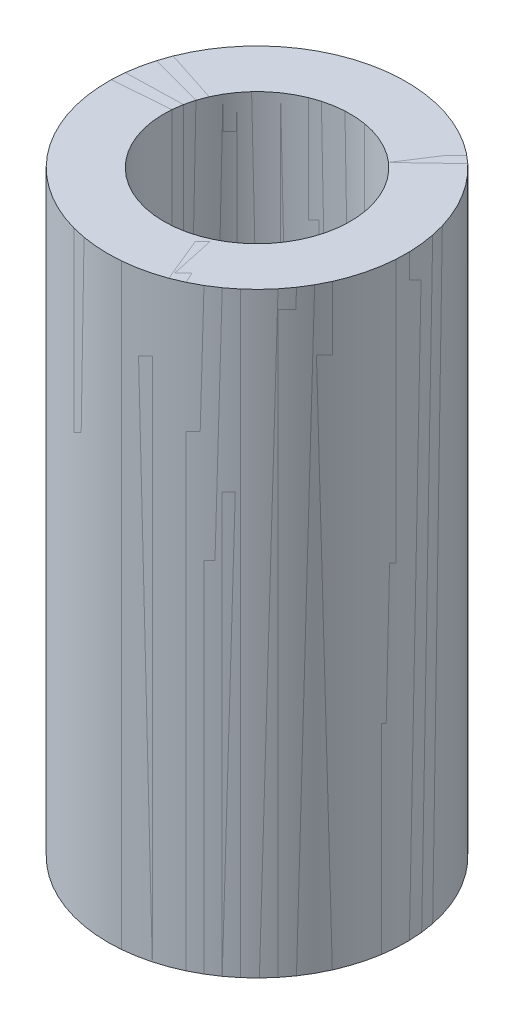
ISO-10303-21;
HEADER;
FILE_DESCRIPTION(('STEP AP214'),'2;1');
FILE_NAME('part.step','',(''),(''),'','','');
FILE_SCHEMA(('AUTOMOTIVE_DESIGN { 1 0 10303 214 1 1 1 1 }'));
ENDSEC;
DATA;
#1=APPLICATION_CONTEXT('core data for automotive mechanical design processes');
#2=APPLICATION_PROTOCOL_DEFINITION('international standard','automotive_design',2000,#1);
#3=PRODUCT_CONTEXT('',#1,'mechanical');
#4=PRODUCT('Part','Part','',(#3));
#5=PRODUCT_RELATED_PRODUCT_CATEGORY('part','',(#4));
#6=PRODUCT_DEFINITION_FORMATION('','',#4);
#7=PRODUCT_DEFINITION_CONTEXT('part definition',#1,'design');
#8=PRODUCT_DEFINITION('design','',#6,#7);
#9=PRODUCT_DEFINITION_SHAPE('','',#8);
#10=(LENGTH_UNIT() NAMED_UNIT(*) SI_UNIT(.MILLI.,.METRE.));
#11=(NAMED_UNIT(*) PLANE_ANGLE_UNIT() SI_UNIT($,.RADIAN.));
#12=(NAMED_UNIT(*) SI_UNIT($,.STERADIAN.) SOLID_ANGLE_UNIT());
#13=UNCERTAINTY_MEASURE_WITH_UNIT(LENGTH_MEASURE(1.E-05),#10,'distance_accuracy_value','');
#14=(GEOMETRIC_REPRESENTATION_CONTEXT(3) GLOBAL_UNCERTAINTY_ASSIGNED_CONTEXT((#13)) GLOBAL_UNIT_ASSIGNED_CONTEXT((#10,
#11,#12)) REPRESENTATION_CONTEXT('',''));
#15=CARTESIAN_POINT('',(0.,0.,0.));
#16=DIRECTION('',(0.,0.,1.));
#17=DIRECTION('',(1.,0.,0.));
#18=AXIS2_PLACEMENT_3D('',#15,#16,#17);
#19=CARTESIAN_POINT('',(0.,8.,0.));
#20=DIRECTION('',(0.,1.,0.));
#21=DIRECTION('',(0.,0.,1.));
#22=AXIS2_PLACEMENT_3D('',#19,#20,#21);
#23=CYLINDRICAL_SURFACE('',#22,2.5);
#24=CARTESIAN_POINT('',(0.,8.,0.));
#25=DIRECTION('',(0.,1.,0.));
#26=DIRECTION('',(0.,0.,1.));
#27=AXIS2_PLACEMENT_3D('',#24,#25,#26);
#28=CIRCLE('',#27,2.5);
#29=CARTESIAN_POINT('',(0.,8.,2.5));
#30=VERTEX_POINT('',#29);
#31=EDGE_CURVE('E63',#30,#30,#28,.T.);
#32=ORIENTED_EDGE('',*,*,#31,.T.);
#33=EDGE_LOOP('',(#32));
#34=FACE_BOUND('',#33,.T.);
#35=CARTESIAN_POINT('',(0.,-8.,0.));
#36=DIRECTION('',(0.,1.,0.));
#37=DIRECTION('',(0.,0.,1.));
#38=AXIS2_PLACEMENT_3D('',#35,#36,#37);
#39=CIRCLE('',#38,2.5);
#40=CARTESIAN_POINT('',(0.,-8.,2.5));
#41=VERTEX_POINT('',#40);
#42=EDGE_CURVE('E11',#41,#41,#39,.T.);
#43=ORIENTED_EDGE('',*,*,#42,.F.);
#44=EDGE_LOOP('',(#43));
#45=FACE_BOUND('',#44,.T.);
#46=ADVANCED_FACE('F49',(#34,#45),#23,.F.);
#47=CARTESIAN_POINT('',(0.,-8.,0.));
#48=DIRECTION('',(0.,1.,0.));
#49=DIRECTION('',(0.,0.,1.));
#50=AXIS2_PLACEMENT_3D('',#47,#48,#49);
#51=PLANE('',#50);
#52=CARTESIAN_POINT('',(0.,-8.,0.));
#53=DIRECTION('',(0.,1.,0.));
#54=DIRECTION('',(0.,0.,1.));
#55=AXIS2_PLACEMENT_3D('',#52,#53,#54);
#56=CIRCLE('',#55,4.);
#57=CARTESIAN_POINT('',(0.,-8.,4.));
#58=VERTEX_POINT('',#57);
#59=EDGE_CURVE('E55',#58,#58,#56,.T.);
#60=ORIENTED_EDGE('',*,*,#59,.F.);
#61=EDGE_LOOP('',(#60));
#62=FACE_BOUND('',#61,.T.);
#63=ORIENTED_EDGE('',*,*,#42,.T.);
#64=EDGE_LOOP('',(#63));
#65=FACE_BOUND('',#64,.T.);
#66=ADVANCED_FACE('F79',(#62,#65),#51,.F.);
#67=CARTESIAN_POINT('',(0.,8.,0.));
#68=DIRECTION('',(0.,1.,0.));
#69=DIRECTION('',(0.,0.,1.));
#70=AXIS2_PLACEMENT_3D('',#67,#68,#69);
#71=CYLINDRICAL_SURFACE('',#70,4.);
#72=CARTESIAN_POINT('',(0.,8.,0.));
#73=DIRECTION('',(0.,1.,0.));
#74=DIRECTION('',(0.,0.,1.));
#75=AXIS2_PLACEMENT_3D('',#72,#73,#74);
#76=CIRCLE('',#75,4.);
#77=CARTESIAN_POINT('',(0.,8.,4.));
#78=VERTEX_POINT('',#77);
#79=EDGE_CURVE('E59',#78,#78,#76,.T.);
#80=ORIENTED_EDGE('',*,*,#79,.F.);
#81=EDGE_LOOP('',(#80));
#82=FACE_BOUND('',#81,.T.);
#83=ORIENTED_EDGE('',*,*,#59,.T.);
#84=EDGE_LOOP('',(#83));
#85=FACE_BOUND('',#84,.T.);
#86=ADVANCED_FACE('F73',(#82,#85),#71,.T.);
#87=CARTESIAN_POINT('',(0.,8.,0.));
#88=DIRECTION('',(0.,1.,0.));
#89=DIRECTION('',(0.,0.,1.));
#90=AXIS2_PLACEMENT_3D('',#87,#88,#89);
#91=PLANE('',#90);
#92=ORIENTED_EDGE('',*,*,#79,.T.);
#93=EDGE_LOOP('',(#92));
#94=FACE_BOUND('',#93,.T.);
#95=ORIENTED_EDGE('',*,*,#31,.F.);
#96=EDGE_LOOP('',(#95));
#97=FACE_BOUND('',#96,.T.);
#98=ADVANCED_FACE('F71',(#94,#97),#91,.T.);
#99=CLOSED_SHELL('',(#46,#66,#86,#98));
#100=MANIFOLD_SOLID_BREP('B2',#99);
#101=CARTESIAN_POINT('',(0.,-8.,0.));
#102=DIRECTION('',(0.,-1.,0.));
#103=DIRECTION('',(0.,0.,-1.));
#104=AXIS2_PLACEMENT_3D('',#101,#102,#103);
#105=PLANE('',#104);
#106=CARTESIAN_POINT('',(0.,-8.,0.));
#107=DIRECTION('',(0.,1.,0.));
#108=DIRECTION('',(0.,0.,1.));
#109=AXIS2_PLACEMENT_3D('',#106,#107,#108);
#110=CIRCLE('',#109,2.5);
#111=CARTESIAN_POINT('',(0.,-8.,2.5));
#112=VERTEX_POINT('',#111);
#113=EDGE_CURVE('E48',#112,#112,#110,.T.);
#114=ORIENTED_EDGE('',*,*,#113,.T.);
#115=EDGE_LOOP('',(#114));
#116=FACE_BOUND('',#115,.T.);
#117=CARTESIAN_POINT('',(0.,-8.,0.));
#118=DIRECTION('',(0.,1.,0.));
#119=DIRECTION('',(0.,0.,1.));
#120=AXIS2_PLACEMENT_3D('',#117,#118,#119);
#121=CIRCLE('',#120,4.);
#122=CARTESIAN_POINT('',(0.,-8.,4.));
#123=VERTEX_POINT('',#122);
#124=EDGE_CURVE('E125',#123,#123,#121,.T.);
#125=ORIENTED_EDGE('',*,*,#124,.F.);
#126=EDGE_LOOP('',(#125));
#127=FACE_BOUND('',#126,.T.);
#128=ADVANCED_FACE('F111',(#116,#127),#105,.T.);
#129=CARTESIAN_POINT('',(0.,8.,0.));
#130=DIRECTION('',(0.,1.,0.));
#131=DIRECTION('',(0.,0.,1.));
#132=AXIS2_PLACEMENT_3D('',#129,#130,#131);
#133=CYLINDRICAL_SURFACE('',#132,2.5);
#134=CARTESIAN_POINT('',(0.,8.,0.));
#135=DIRECTION('',(0.,1.,0.));
#136=DIRECTION('',(0.,0.,1.));
#137=AXIS2_PLACEMENT_3D('',#134,#135,#136);
#138=CIRCLE('',#137,2.5);
#139=CARTESIAN_POINT('',(0.,8.,2.5));
#140=VERTEX_POINT('',#139);
#141=EDGE_CURVE('E117',#140,#140,#138,.T.);
#142=ORIENTED_EDGE('',*,*,#141,.T.);
#143=EDGE_LOOP('',(#142));
#144=FACE_BOUND('',#143,.T.);
#145=ORIENTED_EDGE('',*,*,#113,.F.);
#146=EDGE_LOOP('',(#145));
#147=FACE_BOUND('',#146,.T.);
#148=ADVANCED_FACE('F134',(#144,#147),#133,.F.);
#149=CARTESIAN_POINT('',(0.,8.,0.));
#150=DIRECTION('',(0.,-1.,0.));
#151=DIRECTION('',(0.,0.,-1.));
#152=AXIS2_PLACEMENT_3D('',#149,#150,#151);
#153=PLANE('',#152);
#154=ORIENTED_EDGE('',*,*,#141,.F.);
#155=EDGE_LOOP('',(#154));
#156=FACE_BOUND('',#155,.T.);
#157=CARTESIAN_POINT('',(0.,8.,0.));
#158=DIRECTION('',(0.,1.,0.));
#159=DIRECTION('',(0.,0.,1.));
#160=AXIS2_PLACEMENT_3D('',#157,#158,#159);
#161=CIRCLE('',#160,4.);
#162=CARTESIAN_POINT('',(0.,8.,4.));
#163=VERTEX_POINT('',#162);
#164=EDGE_CURVE('E121',#163,#163,#161,.T.);
#165=ORIENTED_EDGE('',*,*,#164,.T.);
#166=EDGE_LOOP('',(#165));
#167=FACE_BOUND('',#166,.T.);
#168=ADVANCED_FACE('F138',(#156,#167),#153,.F.);
#169=CARTESIAN_POINT('',(0.,8.,0.));
#170=DIRECTION('',(0.,1.,0.));
#171=DIRECTION('',(0.,0.,1.));
#172=AXIS2_PLACEMENT_3D('',#169,#170,#171);
#173=CYLINDRICAL_SURFACE('',#172,4.);
#174=ORIENTED_EDGE('',*,*,#164,.F.);
#175=EDGE_LOOP('',(#174));
#176=FACE_BOUND('',#175,.T.);
#177=ORIENTED_EDGE('',*,*,#124,.T.);
#178=EDGE_LOOP('',(#177));
#179=FACE_BOUND('',#178,.T.);
#180=ADVANCED_FACE('F131',(#176,#179),#173,.T.);
#181=CLOSED_SHELL('',(#128,#148,#168,#180));
#182=MANIFOLD_SOLID_BREP('B6',#181);
#183=ADVANCED_BREP_SHAPE_REPRESENTATION('',(#18,#100,#182),#14);
#184=SHAPE_DEFINITION_REPRESENTATION(#9,#183);
ENDSEC;
END-ISO-10303-21;
